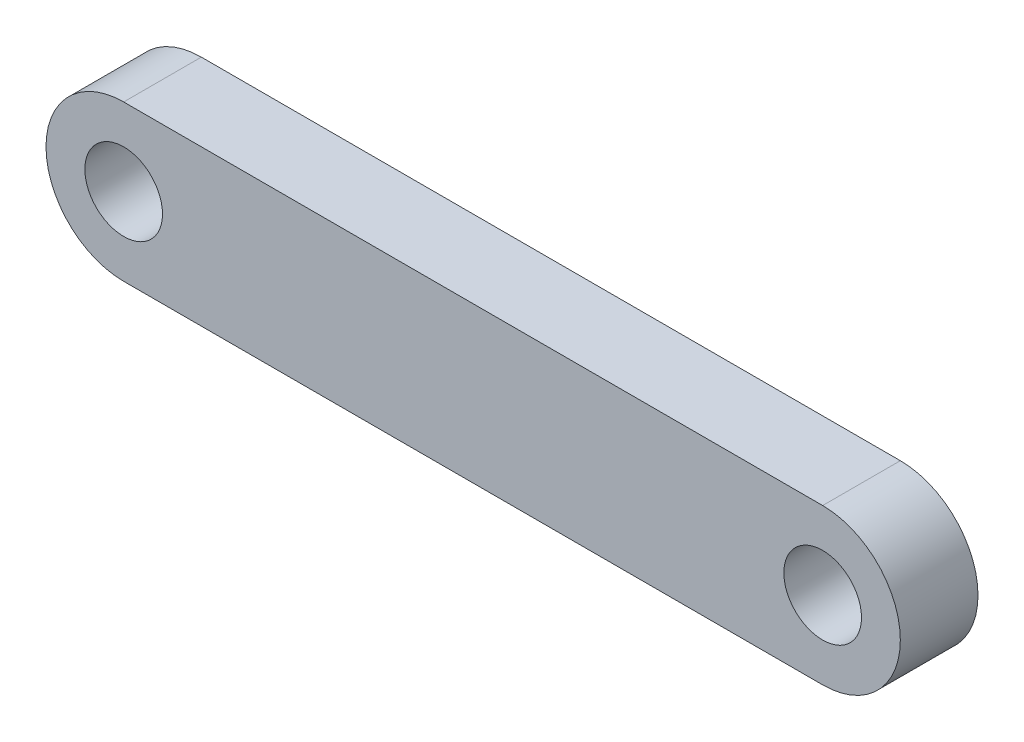
ISO-10303-21;
HEADER;
FILE_DESCRIPTION(('STEP AP214'),'2;1');
FILE_NAME('part.step','',(''),(''),'','','');
FILE_SCHEMA(('AUTOMOTIVE_DESIGN { 1 0 10303 214 1 1 1 1 }'));
ENDSEC;
DATA;
#1=APPLICATION_CONTEXT('core data for automotive mechanical design processes');
#2=APPLICATION_PROTOCOL_DEFINITION('international standard','automotive_design',2000,#1);
#3=PRODUCT_CONTEXT('',#1,'mechanical');
#4=PRODUCT('Part','Part','',(#3));
#5=PRODUCT_RELATED_PRODUCT_CATEGORY('part','',(#4));
#6=PRODUCT_DEFINITION_FORMATION('','',#4);
#7=PRODUCT_DEFINITION_CONTEXT('part definition',#1,'design');
#8=PRODUCT_DEFINITION('design','',#6,#7);
#9=PRODUCT_DEFINITION_SHAPE('','',#8);
#10=(LENGTH_UNIT() NAMED_UNIT(*) SI_UNIT(.MILLI.,.METRE.));
#11=(NAMED_UNIT(*) PLANE_ANGLE_UNIT() SI_UNIT($,.RADIAN.));
#12=(NAMED_UNIT(*) SI_UNIT($,.STERADIAN.) SOLID_ANGLE_UNIT());
#13=UNCERTAINTY_MEASURE_WITH_UNIT(LENGTH_MEASURE(1.E-05),#10,'distance_accuracy_value','');
#14=(GEOMETRIC_REPRESENTATION_CONTEXT(3) GLOBAL_UNCERTAINTY_ASSIGNED_CONTEXT((#13)) GLOBAL_UNIT_ASSIGNED_CONTEXT((#10,
#11,#12)) REPRESENTATION_CONTEXT('',''));
#15=CARTESIAN_POINT('',(0.,0.,0.));
#16=DIRECTION('',(0.,0.,1.));
#17=DIRECTION('',(1.,0.,0.));
#18=AXIS2_PLACEMENT_3D('',#15,#16,#17);
#19=CARTESIAN_POINT('',(0.,29.6340735668456,-5.));
#20=DIRECTION('',(0.,1.,0.));
#21=DIRECTION('',(-1.,0.,0.));
#22=AXIS2_PLACEMENT_3D('',#19,#20,#21);
#23=PLANE('',#22);
#24=DIRECTION('',(-1.,0.,0.));
#25=VECTOR('',#24,1.);
#26=CARTESIAN_POINT('',(0.,29.6340735668456,0.));
#27=LINE('',#26,#25);
#28=CARTESIAN_POINT('',(-59.9966521659382,29.6340735668456,0.));
#29=VERTEX_POINT('',#28);
#30=CARTESIAN_POINT('',(-104.996652165938,29.6340735668456,0.));
#31=VERTEX_POINT('',#30);
#32=EDGE_CURVE('E104',#29,#31,#27,.T.);
#33=ORIENTED_EDGE('',*,*,#32,.F.);
#34=DIRECTION('',(0.,0.,1.));
#35=VECTOR('',#34,1.);
#36=CARTESIAN_POINT('',(-59.9966521659382,29.6340735668456,-5.));
#37=LINE('',#36,#35);
#38=CARTESIAN_POINT('',(-59.9966521659382,29.6340735668456,-5.));
#39=VERTEX_POINT('',#38);
#40=EDGE_CURVE('E11',#39,#29,#37,.T.);
#41=ORIENTED_EDGE('',*,*,#40,.F.);
#42=DIRECTION('',(-1.,0.,0.));
#43=VECTOR('',#42,1.);
#44=CARTESIAN_POINT('',(0.,29.6340735668456,-5.));
#45=LINE('',#44,#43);
#46=CARTESIAN_POINT('',(-104.996652165938,29.6340735668456,-5.));
#47=VERTEX_POINT('',#46);
#48=EDGE_CURVE('E91',#39,#47,#45,.T.);
#49=ORIENTED_EDGE('',*,*,#48,.T.);
#50=DIRECTION('',(0.,0.,1.));
#51=VECTOR('',#50,1.);
#52=CARTESIAN_POINT('',(-104.996652165938,29.6340735668456,-5.));
#53=LINE('',#52,#51);
#54=EDGE_CURVE('E36',#47,#31,#53,.T.);
#55=ORIENTED_EDGE('',*,*,#54,.T.);
#56=EDGE_LOOP('',(#33,#41,#49,#55));
#57=FACE_BOUND('',#56,.T.);
#58=ADVANCED_FACE('F32',(#57),#23,.T.);
#59=CARTESIAN_POINT('',(-59.9966521659382,24.6340735668456,-5.));
#60=DIRECTION('',(0.,0.,1.));
#61=DIRECTION('',(1.,0.,0.));
#62=AXIS2_PLACEMENT_3D('',#59,#60,#61);
#63=CYLINDRICAL_SURFACE('',#62,5.);
#64=CARTESIAN_POINT('',(-59.9966521659382,24.6340735668456,0.));
#65=DIRECTION('',(0.,0.,1.));
#66=DIRECTION('',(1.,0.,0.));
#67=AXIS2_PLACEMENT_3D('',#64,#65,#66);
#68=CIRCLE('',#67,5.);
#69=CARTESIAN_POINT('',(-59.9966521659382,19.6340735668456,0.));
#70=VERTEX_POINT('',#69);
#71=EDGE_CURVE('E110',#70,#29,#68,.T.);
#72=ORIENTED_EDGE('',*,*,#71,.F.);
#73=DIRECTION('',(0.,0.,1.));
#74=VECTOR('',#73,1.);
#75=CARTESIAN_POINT('',(-59.9966521659382,19.6340735668456,-5.));
#76=LINE('',#75,#74);
#77=CARTESIAN_POINT('',(-59.9966521659382,19.6340735668456,-5.));
#78=VERTEX_POINT('',#77);
#79=EDGE_CURVE('E42',#78,#70,#76,.T.);
#80=ORIENTED_EDGE('',*,*,#79,.F.);
#81=CARTESIAN_POINT('',(-59.9966521659382,24.6340735668456,-5.));
#82=DIRECTION('',(0.,0.,1.));
#83=DIRECTION('',(1.,0.,0.));
#84=AXIS2_PLACEMENT_3D('',#81,#82,#83);
#85=CIRCLE('',#84,5.);
#86=EDGE_CURVE('E84',#78,#39,#85,.T.);
#87=ORIENTED_EDGE('',*,*,#86,.T.);
#88=ORIENTED_EDGE('',*,*,#40,.T.);
#89=EDGE_LOOP('',(#72,#80,#87,#88));
#90=FACE_BOUND('',#89,.T.);
#91=ADVANCED_FACE('F132',(#90),#63,.T.);
#92=CARTESIAN_POINT('',(0.,19.6340735668456,-5.));
#93=DIRECTION('',(0.,1.,0.));
#94=DIRECTION('',(-1.,0.,0.));
#95=AXIS2_PLACEMENT_3D('',#92,#93,#94);
#96=PLANE('',#95);
#97=DIRECTION('',(-1.,0.,0.));
#98=VECTOR('',#97,1.);
#99=CARTESIAN_POINT('',(0.,19.6340735668456,0.));
#100=LINE('',#99,#98);
#101=CARTESIAN_POINT('',(-104.996652165938,19.6340735668456,0.));
#102=VERTEX_POINT('',#101);
#103=EDGE_CURVE('E88',#70,#102,#100,.T.);
#104=ORIENTED_EDGE('',*,*,#103,.T.);
#105=DIRECTION('',(0.,0.,1.));
#106=VECTOR('',#105,1.);
#107=CARTESIAN_POINT('',(-104.996652165938,19.6340735668456,-5.));
#108=LINE('',#107,#106);
#109=CARTESIAN_POINT('',(-104.996652165938,19.6340735668456,-5.));
#110=VERTEX_POINT('',#109);
#111=EDGE_CURVE('E86',#110,#102,#108,.T.);
#112=ORIENTED_EDGE('',*,*,#111,.F.);
#113=DIRECTION('',(-1.,0.,0.));
#114=VECTOR('',#113,1.);
#115=CARTESIAN_POINT('',(0.,19.6340735668456,-5.));
#116=LINE('',#115,#114);
#117=EDGE_CURVE('E80',#78,#110,#116,.T.);
#118=ORIENTED_EDGE('',*,*,#117,.F.);
#119=ORIENTED_EDGE('',*,*,#79,.T.);
#120=EDGE_LOOP('',(#104,#112,#118,#119));
#121=FACE_BOUND('',#120,.T.);
#122=ADVANCED_FACE('F87',(#121),#96,.F.);
#123=CARTESIAN_POINT('',(-59.9966521659382,24.6340735668456,-5.));
#124=DIRECTION('',(0.,0.,1.));
#125=DIRECTION('',(1.,0.,0.));
#126=AXIS2_PLACEMENT_3D('',#123,#124,#125);
#127=CYLINDRICAL_SURFACE('',#126,2.50000000000001);
#128=CARTESIAN_POINT('',(-59.9966521659382,24.6340735668456,-5.));
#129=DIRECTION('',(0.,0.,1.));
#130=DIRECTION('',(1.,0.,0.));
#131=AXIS2_PLACEMENT_3D('',#128,#129,#130);
#132=CIRCLE('',#131,2.50000000000001);
#133=CARTESIAN_POINT('',(-57.4966521659382,24.6340735668456,-5.));
#134=VERTEX_POINT('',#133);
#135=EDGE_CURVE('E93',#134,#134,#132,.T.);
#136=ORIENTED_EDGE('',*,*,#135,.F.);
#137=EDGE_LOOP('',(#136));
#138=FACE_BOUND('',#137,.T.);
#139=CARTESIAN_POINT('',(-59.9966521659382,24.6340735668456,0.));
#140=DIRECTION('',(0.,0.,1.));
#141=DIRECTION('',(1.,0.,0.));
#142=AXIS2_PLACEMENT_3D('',#139,#140,#141);
#143=CIRCLE('',#142,2.50000000000001);
#144=CARTESIAN_POINT('',(-57.4966521659382,24.6340735668456,0.));
#145=VERTEX_POINT('',#144);
#146=EDGE_CURVE('E101',#145,#145,#143,.T.);
#147=ORIENTED_EDGE('',*,*,#146,.T.);
#148=EDGE_LOOP('',(#147));
#149=FACE_BOUND('',#148,.T.);
#150=ADVANCED_FACE('F123',(#138,#149),#127,.F.);
#151=CARTESIAN_POINT('',(-104.996652165938,24.6340735668456,-5.));
#152=DIRECTION('',(0.,0.,1.));
#153=DIRECTION('',(1.,0.,0.));
#154=AXIS2_PLACEMENT_3D('',#151,#152,#153);
#155=CYLINDRICAL_SURFACE('',#154,2.5);
#156=CARTESIAN_POINT('',(-104.996652165938,24.6340735668456,-5.));
#157=DIRECTION('',(0.,0.,1.));
#158=DIRECTION('',(1.,0.,0.));
#159=AXIS2_PLACEMENT_3D('',#156,#157,#158);
#160=CIRCLE('',#159,2.5);
#161=CARTESIAN_POINT('',(-102.496652165938,24.6340735668456,-5.));
#162=VERTEX_POINT('',#161);
#163=EDGE_CURVE('E112',#162,#162,#160,.T.);
#164=ORIENTED_EDGE('',*,*,#163,.F.);
#165=EDGE_LOOP('',(#164));
#166=FACE_BOUND('',#165,.T.);
#167=CARTESIAN_POINT('',(-104.996652165938,24.6340735668456,0.));
#168=DIRECTION('',(0.,0.,1.));
#169=DIRECTION('',(1.,0.,0.));
#170=AXIS2_PLACEMENT_3D('',#167,#168,#169);
#171=CIRCLE('',#170,2.5);
#172=CARTESIAN_POINT('',(-102.496652165938,24.6340735668456,0.));
#173=VERTEX_POINT('',#172);
#174=EDGE_CURVE('E98',#173,#173,#171,.T.);
#175=ORIENTED_EDGE('',*,*,#174,.T.);
#176=EDGE_LOOP('',(#175));
#177=FACE_BOUND('',#176,.T.);
#178=ADVANCED_FACE('F34',(#166,#177),#155,.F.);
#179=CARTESIAN_POINT('',(-104.996652165938,24.6340735668456,-5.));
#180=DIRECTION('',(0.,0.,1.));
#181=DIRECTION('',(1.,0.,0.));
#182=AXIS2_PLACEMENT_3D('',#179,#180,#181);
#183=CYLINDRICAL_SURFACE('',#182,5.);
#184=CARTESIAN_POINT('',(-104.996652165938,24.6340735668456,0.));
#185=DIRECTION('',(0.,0.,1.));
#186=DIRECTION('',(1.,0.,0.));
#187=AXIS2_PLACEMENT_3D('',#184,#185,#186);
#188=CIRCLE('',#187,5.);
#189=EDGE_CURVE('E107',#31,#102,#188,.T.);
#190=ORIENTED_EDGE('',*,*,#189,.F.);
#191=ORIENTED_EDGE('',*,*,#54,.F.);
#192=CARTESIAN_POINT('',(-104.996652165938,24.6340735668456,-5.));
#193=DIRECTION('',(0.,0.,1.));
#194=DIRECTION('',(1.,0.,0.));
#195=AXIS2_PLACEMENT_3D('',#192,#193,#194);
#196=CIRCLE('',#195,5.);
#197=EDGE_CURVE('E83',#47,#110,#196,.T.);
#198=ORIENTED_EDGE('',*,*,#197,.T.);
#199=ORIENTED_EDGE('',*,*,#111,.T.);
#200=EDGE_LOOP('',(#190,#191,#198,#199));
#201=FACE_BOUND('',#200,.T.);
#202=ADVANCED_FACE('F90',(#201),#183,.T.);
#203=CARTESIAN_POINT('',(0.,0.,-5.));
#204=DIRECTION('',(0.,0.,1.));
#205=DIRECTION('',(1.,0.,0.));
#206=AXIS2_PLACEMENT_3D('',#203,#204,#205);
#207=PLANE('',#206);
#208=ORIENTED_EDGE('',*,*,#163,.T.);
#209=EDGE_LOOP('',(#208));
#210=FACE_BOUND('',#209,.T.);
#211=ORIENTED_EDGE('',*,*,#135,.T.);
#212=EDGE_LOOP('',(#211));
#213=FACE_BOUND('',#212,.T.);
#214=ORIENTED_EDGE('',*,*,#48,.F.);
#215=ORIENTED_EDGE('',*,*,#86,.F.);
#216=ORIENTED_EDGE('',*,*,#117,.T.);
#217=ORIENTED_EDGE('',*,*,#197,.F.);
#218=EDGE_LOOP('',(#214,#215,#216,#217));
#219=FACE_BOUND('',#218,.T.);
#220=ADVANCED_FACE('F82',(#210,#213,#219),#207,.F.);
#221=CARTESIAN_POINT('',(0.,0.,0.));
#222=DIRECTION('',(0.,0.,1.));
#223=DIRECTION('',(1.,0.,0.));
#224=AXIS2_PLACEMENT_3D('',#221,#222,#223);
#225=PLANE('',#224);
#226=ORIENTED_EDGE('',*,*,#174,.F.);
#227=EDGE_LOOP('',(#226));
#228=FACE_BOUND('',#227,.T.);
#229=ORIENTED_EDGE('',*,*,#146,.F.);
#230=EDGE_LOOP('',(#229));
#231=FACE_BOUND('',#230,.T.);
#232=ORIENTED_EDGE('',*,*,#32,.T.);
#233=ORIENTED_EDGE('',*,*,#189,.T.);
#234=ORIENTED_EDGE('',*,*,#103,.F.);
#235=ORIENTED_EDGE('',*,*,#71,.T.);
#236=EDGE_LOOP('',(#232,#233,#234,#235));
#237=FACE_BOUND('',#236,.T.);
#238=ADVANCED_FACE('F128',(#228,#231,#237),#225,.T.);
#239=CLOSED_SHELL('',(#58,#91,#122,#150,#178,#202,#220,#238));
#240=MANIFOLD_SOLID_BREP('B2',#239);
#241=ADVANCED_BREP_SHAPE_REPRESENTATION('',(#18,#240),#14);
#242=SHAPE_DEFINITION_REPRESENTATION(#9,#241);
ENDSEC;
END-ISO-10303-21;
